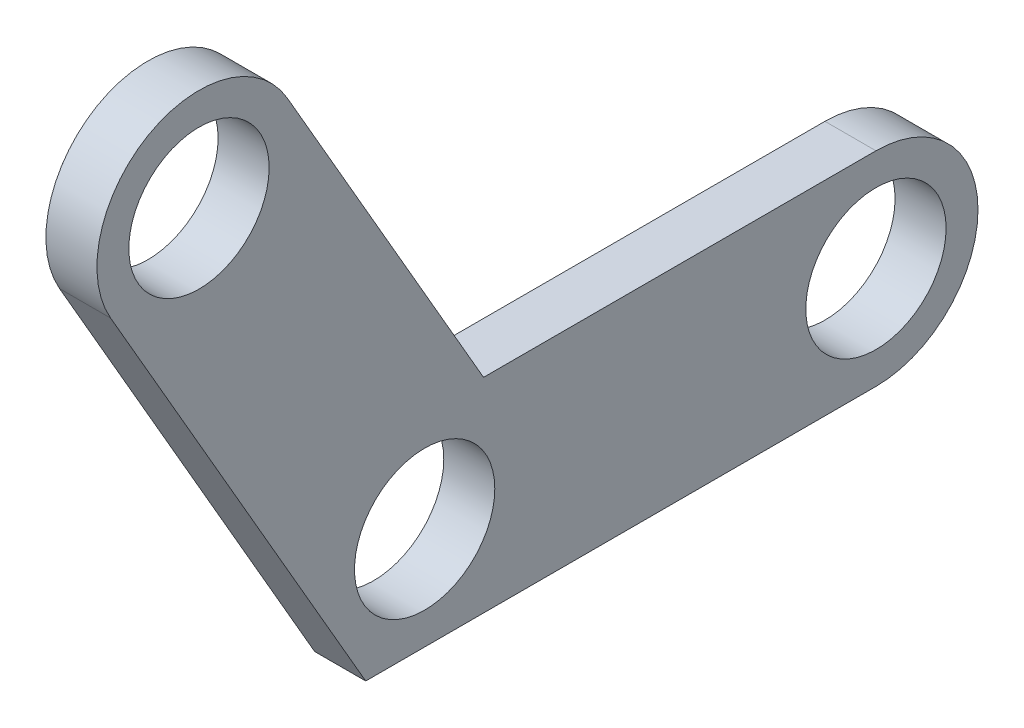
ISO-10303-21;
HEADER;
FILE_DESCRIPTION(('STEP AP214'),'2;1');
FILE_NAME('part.step','',(''),(''),'','','');
FILE_SCHEMA(('AUTOMOTIVE_DESIGN { 1 0 10303 214 1 1 1 1 }'));
ENDSEC;
DATA;
#1=APPLICATION_CONTEXT('core data for automotive mechanical design processes');
#2=APPLICATION_PROTOCOL_DEFINITION('international standard','automotive_design',2000,#1);
#3=PRODUCT_CONTEXT('',#1,'mechanical');
#4=PRODUCT('Part','Part','',(#3));
#5=PRODUCT_RELATED_PRODUCT_CATEGORY('part','',(#4));
#6=PRODUCT_DEFINITION_FORMATION('','',#4);
#7=PRODUCT_DEFINITION_CONTEXT('part definition',#1,'design');
#8=PRODUCT_DEFINITION('design','',#6,#7);
#9=PRODUCT_DEFINITION_SHAPE('','',#8);
#10=(LENGTH_UNIT() NAMED_UNIT(*) SI_UNIT(.MILLI.,.METRE.));
#11=(NAMED_UNIT(*) PLANE_ANGLE_UNIT() SI_UNIT($,.RADIAN.));
#12=(NAMED_UNIT(*) SI_UNIT($,.STERADIAN.) SOLID_ANGLE_UNIT());
#13=UNCERTAINTY_MEASURE_WITH_UNIT(LENGTH_MEASURE(1.E-05),#10,'distance_accuracy_value','');
#14=(GEOMETRIC_REPRESENTATION_CONTEXT(3) GLOBAL_UNCERTAINTY_ASSIGNED_CONTEXT((#13)) GLOBAL_UNIT_ASSIGNED_CONTEXT((#10,
#11,#12)) REPRESENTATION_CONTEXT('',''));
#15=CARTESIAN_POINT('',(0.,0.,0.));
#16=DIRECTION('',(0.,0.,1.));
#17=DIRECTION('',(1.,0.,0.));
#18=AXIS2_PLACEMENT_3D('',#15,#16,#17);
#19=CARTESIAN_POINT('',(2.,4.,-20.));
#20=DIRECTION('',(1.,0.,0.));
#21=DIRECTION('',(0.,0.,-1.));
#22=AXIS2_PLACEMENT_3D('',#19,#20,#21);
#23=PLANE('',#22);
#24=CARTESIAN_POINT('',(2.,4.,-20.));
#25=DIRECTION('',(1.,0.,0.));
#26=DIRECTION('',(0.,0.,-1.));
#27=AXIS2_PLACEMENT_3D('',#24,#25,#26);
#28=CIRCLE('',#27,2.74999999999998);
#29=CARTESIAN_POINT('',(2.,4.,-22.75));
#30=VERTEX_POINT('',#29);
#31=EDGE_CURVE('E213',#30,#30,#28,.T.);
#32=ORIENTED_EDGE('',*,*,#31,.F.);
#33=EDGE_LOOP('',(#32));
#34=FACE_BOUND('',#33,.T.);
#35=DIRECTION('',(0.,0.,-1.));
#36=VECTOR('',#35,1.);
#37=CARTESIAN_POINT('',(2.,0.,0.));
#38=LINE('',#37,#36);
#39=CARTESIAN_POINT('',(2.,0.,0.));
#40=VERTEX_POINT('',#39);
#41=CARTESIAN_POINT('',(2.,0.,-20.));
#42=VERTEX_POINT('',#41);
#43=EDGE_CURVE('E152',#40,#42,#38,.T.);
#44=ORIENTED_EDGE('',*,*,#43,.T.);
#45=CARTESIAN_POINT('',(2.,4.,-20.));
#46=DIRECTION('',(1.,0.,0.));
#47=DIRECTION('',(0.,0.,-1.));
#48=AXIS2_PLACEMENT_3D('',#45,#46,#47);
#49=CIRCLE('',#48,4.);
#50=CARTESIAN_POINT('',(2.,8.,-20.));
#51=VERTEX_POINT('',#50);
#52=EDGE_CURVE('E100',#42,#51,#49,.T.);
#53=ORIENTED_EDGE('',*,*,#52,.T.);
#54=DIRECTION('',(0.,0.,1.));
#55=VECTOR('',#54,1.);
#56=CARTESIAN_POINT('',(2.,8.,-4.61880215351696));
#57=LINE('',#56,#55);
#58=CARTESIAN_POINT('',(2.,8.,-4.61880215351696));
#59=VERTEX_POINT('',#58);
#60=EDGE_CURVE('E113',#51,#59,#57,.T.);
#61=ORIENTED_EDGE('',*,*,#60,.T.);
#62=DIRECTION('',(0.,0.86602540378444,0.499999999999998));
#63=VECTOR('',#62,1.);
#64=CARTESIAN_POINT('',(2.,21.3205080756887,3.07179676972448));
#65=LINE('',#64,#63);
#66=CARTESIAN_POINT('',(2.,21.3205080756888,3.07179676972446));
#67=VERTEX_POINT('',#66);
#68=EDGE_CURVE('E107',#59,#67,#65,.T.);
#69=ORIENTED_EDGE('',*,*,#68,.T.);
#70=CARTESIAN_POINT('',(2.,19.3205080756888,6.5358983848622));
#71=DIRECTION('',(1.,0.,0.));
#72=DIRECTION('',(0.,0.,-1.));
#73=AXIS2_PLACEMENT_3D('',#70,#71,#72);
#74=CIRCLE('',#73,3.99999999999998);
#75=CARTESIAN_POINT('',(2.,17.3205080756888,9.99999999999996));
#76=VERTEX_POINT('',#75);
#77=EDGE_CURVE('E111',#67,#76,#74,.T.);
#78=ORIENTED_EDGE('',*,*,#77,.T.);
#79=DIRECTION('',(0.,-0.86602540378444,-0.499999999999998));
#80=VECTOR('',#79,1.);
#81=CARTESIAN_POINT('',(2.,0.,0.));
#82=LINE('',#81,#80);
#83=EDGE_CURVE('E63',#76,#40,#82,.T.);
#84=ORIENTED_EDGE('',*,*,#83,.T.);
#85=EDGE_LOOP('',(#44,#53,#61,#69,#78,#84));
#86=FACE_BOUND('',#85,.T.);
#87=CARTESIAN_POINT('',(2.,19.3205080756888,6.5358983848622));
#88=DIRECTION('',(1.,0.,0.));
#89=DIRECTION('',(0.,0.,-1.));
#90=AXIS2_PLACEMENT_3D('',#87,#88,#89);
#91=CIRCLE('',#90,2.75);
#92=CARTESIAN_POINT('',(2.,19.3205080756888,3.7858983848622));
#93=VERTEX_POINT('',#92);
#94=EDGE_CURVE('E140',#93,#93,#91,.T.);
#95=ORIENTED_EDGE('',*,*,#94,.F.);
#96=EDGE_LOOP('',(#95));
#97=FACE_BOUND('',#96,.T.);
#98=CARTESIAN_POINT('',(2.,4.,-2.30940107675851));
#99=DIRECTION('',(1.,0.,0.));
#100=DIRECTION('',(0.,0.,-1.));
#101=AXIS2_PLACEMENT_3D('',#98,#99,#100);
#102=CIRCLE('',#101,2.75);
#103=CARTESIAN_POINT('',(2.,4.,-5.05940107675851));
#104=VERTEX_POINT('',#103);
#105=EDGE_CURVE('E202',#104,#104,#102,.T.);
#106=ORIENTED_EDGE('',*,*,#105,.F.);
#107=EDGE_LOOP('',(#106));
#108=FACE_BOUND('',#107,.T.);
#109=ADVANCED_FACE('F45',(#34,#86,#97,#108),#23,.T.);
#110=CARTESIAN_POINT('',(0.,4.,-20.));
#111=DIRECTION('',(1.,0.,0.));
#112=DIRECTION('',(0.,0.,-1.));
#113=AXIS2_PLACEMENT_3D('',#110,#111,#112);
#114=PLANE('',#113);
#115=DIRECTION('',(0.,0.,-1.));
#116=VECTOR('',#115,1.);
#117=CARTESIAN_POINT('',(0.,0.,0.));
#118=LINE('',#117,#116);
#119=CARTESIAN_POINT('',(0.,0.,0.));
#120=VERTEX_POINT('',#119);
#121=CARTESIAN_POINT('',(0.,0.,-20.));
#122=VERTEX_POINT('',#121);
#123=EDGE_CURVE('E135',#120,#122,#118,.T.);
#124=ORIENTED_EDGE('',*,*,#123,.F.);
#125=DIRECTION('',(0.,-0.86602540378444,-0.499999999999998));
#126=VECTOR('',#125,1.);
#127=CARTESIAN_POINT('',(0.,0.,0.));
#128=LINE('',#127,#126);
#129=CARTESIAN_POINT('',(0.,17.3205080756888,9.99999999999996));
#130=VERTEX_POINT('',#129);
#131=EDGE_CURVE('E92',#130,#120,#128,.T.);
#132=ORIENTED_EDGE('',*,*,#131,.F.);
#133=CARTESIAN_POINT('',(0.,19.3205080756888,6.5358983848622));
#134=DIRECTION('',(1.,0.,0.));
#135=DIRECTION('',(0.,0.,-1.));
#136=AXIS2_PLACEMENT_3D('',#133,#134,#135);
#137=CIRCLE('',#136,3.99999999999998);
#138=CARTESIAN_POINT('',(0.,21.3205080756888,3.07179676972446));
#139=VERTEX_POINT('',#138);
#140=EDGE_CURVE('E86',#139,#130,#137,.T.);
#141=ORIENTED_EDGE('',*,*,#140,.F.);
#142=DIRECTION('',(0.,0.86602540378444,0.499999999999998));
#143=VECTOR('',#142,1.);
#144=CARTESIAN_POINT('',(0.,21.3205080756887,3.07179676972448));
#145=LINE('',#144,#143);
#146=CARTESIAN_POINT('',(0.,8.,-4.61880215351696));
#147=VERTEX_POINT('',#146);
#148=EDGE_CURVE('E122',#147,#139,#145,.T.);
#149=ORIENTED_EDGE('',*,*,#148,.F.);
#150=DIRECTION('',(0.,0.,1.));
#151=VECTOR('',#150,1.);
#152=CARTESIAN_POINT('',(0.,8.,-4.61880215351696));
#153=LINE('',#152,#151);
#154=CARTESIAN_POINT('',(0.,8.,-20.));
#155=VERTEX_POINT('',#154);
#156=EDGE_CURVE('E143',#155,#147,#153,.T.);
#157=ORIENTED_EDGE('',*,*,#156,.F.);
#158=CARTESIAN_POINT('',(0.,4.,-20.));
#159=DIRECTION('',(1.,0.,0.));
#160=DIRECTION('',(0.,0.,-1.));
#161=AXIS2_PLACEMENT_3D('',#158,#159,#160);
#162=CIRCLE('',#161,4.);
#163=EDGE_CURVE('E139',#122,#155,#162,.T.);
#164=ORIENTED_EDGE('',*,*,#163,.F.);
#165=EDGE_LOOP('',(#124,#132,#141,#149,#157,#164));
#166=FACE_BOUND('',#165,.T.);
#167=CARTESIAN_POINT('',(0.,19.3205080756888,6.5358983848622));
#168=DIRECTION('',(1.,0.,0.));
#169=DIRECTION('',(0.,0.,-1.));
#170=AXIS2_PLACEMENT_3D('',#167,#168,#169);
#171=CIRCLE('',#170,2.75);
#172=CARTESIAN_POINT('',(0.,19.3205080756888,3.7858983848622));
#173=VERTEX_POINT('',#172);
#174=EDGE_CURVE('E217',#173,#173,#171,.T.);
#175=ORIENTED_EDGE('',*,*,#174,.T.);
#176=EDGE_LOOP('',(#175));
#177=FACE_BOUND('',#176,.T.);
#178=CARTESIAN_POINT('',(0.,4.,-20.));
#179=DIRECTION('',(1.,0.,0.));
#180=DIRECTION('',(0.,0.,-1.));
#181=AXIS2_PLACEMENT_3D('',#178,#179,#180);
#182=CIRCLE('',#181,2.74999999999998);
#183=CARTESIAN_POINT('',(0.,4.,-22.75));
#184=VERTEX_POINT('',#183);
#185=EDGE_CURVE('E210',#184,#184,#182,.T.);
#186=ORIENTED_EDGE('',*,*,#185,.T.);
#187=EDGE_LOOP('',(#186));
#188=FACE_BOUND('',#187,.T.);
#189=CARTESIAN_POINT('',(0.,4.,-2.30940107675851));
#190=DIRECTION('',(1.,0.,0.));
#191=DIRECTION('',(0.,0.,-1.));
#192=AXIS2_PLACEMENT_3D('',#189,#190,#191);
#193=CIRCLE('',#192,2.75);
#194=CARTESIAN_POINT('',(0.,4.,-5.05940107675851));
#195=VERTEX_POINT('',#194);
#196=EDGE_CURVE('E205',#195,#195,#193,.T.);
#197=ORIENTED_EDGE('',*,*,#196,.T.);
#198=EDGE_LOOP('',(#197));
#199=FACE_BOUND('',#198,.T.);
#200=ADVANCED_FACE('F165',(#166,#177,#188,#199),#114,.F.);
#201=CARTESIAN_POINT('',(2.,0.,0.));
#202=DIRECTION('',(0.,1.,0.));
#203=DIRECTION('',(0.,0.,1.));
#204=AXIS2_PLACEMENT_3D('',#201,#202,#203);
#205=PLANE('',#204);
#206=ORIENTED_EDGE('',*,*,#123,.T.);
#207=DIRECTION('',(-1.,0.,0.));
#208=VECTOR('',#207,1.);
#209=CARTESIAN_POINT('',(2.,0.,-20.));
#210=LINE('',#209,#208);
#211=EDGE_CURVE('E11',#42,#122,#210,.T.);
#212=ORIENTED_EDGE('',*,*,#211,.F.);
#213=ORIENTED_EDGE('',*,*,#43,.F.);
#214=DIRECTION('',(-1.,0.,0.));
#215=VECTOR('',#214,1.);
#216=CARTESIAN_POINT('',(2.,0.,0.));
#217=LINE('',#216,#215);
#218=EDGE_CURVE('E131',#40,#120,#217,.T.);
#219=ORIENTED_EDGE('',*,*,#218,.T.);
#220=EDGE_LOOP('',(#206,#212,#213,#219));
#221=FACE_BOUND('',#220,.T.);
#222=ADVANCED_FACE('F47',(#221),#205,.F.);
#223=CARTESIAN_POINT('',(2.,4.,-20.));
#224=DIRECTION('',(-1.,0.,0.));
#225=DIRECTION('',(0.,0.,1.));
#226=AXIS2_PLACEMENT_3D('',#223,#224,#225);
#227=CYLINDRICAL_SURFACE('',#226,4.);
#228=ORIENTED_EDGE('',*,*,#163,.T.);
#229=DIRECTION('',(-1.,0.,0.));
#230=VECTOR('',#229,1.);
#231=CARTESIAN_POINT('',(2.,8.,-20.));
#232=LINE('',#231,#230);
#233=EDGE_CURVE('E55',#51,#155,#232,.T.);
#234=ORIENTED_EDGE('',*,*,#233,.F.);
#235=ORIENTED_EDGE('',*,*,#52,.F.);
#236=ORIENTED_EDGE('',*,*,#211,.T.);
#237=EDGE_LOOP('',(#228,#234,#235,#236));
#238=FACE_BOUND('',#237,.T.);
#239=ADVANCED_FACE('F276',(#238),#227,.T.);
#240=CARTESIAN_POINT('',(2.,8.,-4.61880215351696));
#241=DIRECTION('',(0.,-1.,0.));
#242=DIRECTION('',(0.,0.,-1.));
#243=AXIS2_PLACEMENT_3D('',#240,#241,#242);
#244=PLANE('',#243);
#245=ORIENTED_EDGE('',*,*,#156,.T.);
#246=DIRECTION('',(-1.,0.,0.));
#247=VECTOR('',#246,1.);
#248=CARTESIAN_POINT('',(2.,8.,-4.61880215351696));
#249=LINE('',#248,#247);
#250=EDGE_CURVE('E124',#59,#147,#249,.T.);
#251=ORIENTED_EDGE('',*,*,#250,.F.);
#252=ORIENTED_EDGE('',*,*,#60,.F.);
#253=ORIENTED_EDGE('',*,*,#233,.T.);
#254=EDGE_LOOP('',(#245,#251,#252,#253));
#255=FACE_BOUND('',#254,.T.);
#256=ADVANCED_FACE('F162',(#255),#244,.F.);
#257=CARTESIAN_POINT('',(2.,21.3205080756887,3.07179676972448));
#258=DIRECTION('',(0.,-0.499999999999998,0.86602540378444));
#259=DIRECTION('',(0.,-0.86602540378444,-0.499999999999998));
#260=AXIS2_PLACEMENT_3D('',#257,#258,#259);
#261=PLANE('',#260);
#262=ORIENTED_EDGE('',*,*,#148,.T.);
#263=DIRECTION('',(-1.,0.,0.));
#264=VECTOR('',#263,1.);
#265=CARTESIAN_POINT('',(2.,21.3205080756888,3.07179676972446));
#266=LINE('',#265,#264);
#267=EDGE_CURVE('E119',#67,#139,#266,.T.);
#268=ORIENTED_EDGE('',*,*,#267,.F.);
#269=ORIENTED_EDGE('',*,*,#68,.F.);
#270=ORIENTED_EDGE('',*,*,#250,.T.);
#271=EDGE_LOOP('',(#262,#268,#269,#270));
#272=FACE_BOUND('',#271,.T.);
#273=ADVANCED_FACE('F120',(#272),#261,.F.);
#274=CARTESIAN_POINT('',(2.,19.3205080756888,6.5358983848622));
#275=DIRECTION('',(-1.,0.,0.));
#276=DIRECTION('',(0.,0.,1.));
#277=AXIS2_PLACEMENT_3D('',#274,#275,#276);
#278=CYLINDRICAL_SURFACE('',#277,3.99999999999998);
#279=ORIENTED_EDGE('',*,*,#140,.T.);
#280=DIRECTION('',(-1.,0.,0.));
#281=VECTOR('',#280,1.);
#282=CARTESIAN_POINT('',(2.,17.3205080756888,9.99999999999996));
#283=LINE('',#282,#281);
#284=EDGE_CURVE('E125',#76,#130,#283,.T.);
#285=ORIENTED_EDGE('',*,*,#284,.F.);
#286=ORIENTED_EDGE('',*,*,#77,.F.);
#287=ORIENTED_EDGE('',*,*,#267,.T.);
#288=EDGE_LOOP('',(#279,#285,#286,#287));
#289=FACE_BOUND('',#288,.T.);
#290=ADVANCED_FACE('F127',(#289),#278,.T.);
#291=CARTESIAN_POINT('',(2.,0.,0.));
#292=DIRECTION('',(0.,0.499999999999998,-0.86602540378444));
#293=DIRECTION('',(0.,0.86602540378444,0.499999999999998));
#294=AXIS2_PLACEMENT_3D('',#291,#292,#293);
#295=PLANE('',#294);
#296=ORIENTED_EDGE('',*,*,#131,.T.);
#297=ORIENTED_EDGE('',*,*,#218,.F.);
#298=ORIENTED_EDGE('',*,*,#83,.F.);
#299=ORIENTED_EDGE('',*,*,#284,.T.);
#300=EDGE_LOOP('',(#296,#297,#298,#299));
#301=FACE_BOUND('',#300,.T.);
#302=ADVANCED_FACE('F170',(#301),#295,.F.);
#303=CARTESIAN_POINT('',(2.,19.3205080756888,6.5358983848622));
#304=DIRECTION('',(-1.,0.,0.));
#305=DIRECTION('',(0.,0.,1.));
#306=AXIS2_PLACEMENT_3D('',#303,#304,#305);
#307=CYLINDRICAL_SURFACE('',#306,2.75);
#308=ORIENTED_EDGE('',*,*,#94,.T.);
#309=EDGE_LOOP('',(#308));
#310=FACE_BOUND('',#309,.T.);
#311=ORIENTED_EDGE('',*,*,#174,.F.);
#312=EDGE_LOOP('',(#311));
#313=FACE_BOUND('',#312,.T.);
#314=ADVANCED_FACE('F172',(#310,#313),#307,.F.);
#315=CARTESIAN_POINT('',(2.,4.,-20.));
#316=DIRECTION('',(-1.,0.,0.));
#317=DIRECTION('',(0.,0.,1.));
#318=AXIS2_PLACEMENT_3D('',#315,#316,#317);
#319=CYLINDRICAL_SURFACE('',#318,2.74999999999998);
#320=ORIENTED_EDGE('',*,*,#31,.T.);
#321=EDGE_LOOP('',(#320));
#322=FACE_BOUND('',#321,.T.);
#323=ORIENTED_EDGE('',*,*,#185,.F.);
#324=EDGE_LOOP('',(#323));
#325=FACE_BOUND('',#324,.T.);
#326=ADVANCED_FACE('F178',(#322,#325),#319,.F.);
#327=CARTESIAN_POINT('',(2.,4.,-2.30940107675851));
#328=DIRECTION('',(-1.,0.,0.));
#329=DIRECTION('',(0.,0.,1.));
#330=AXIS2_PLACEMENT_3D('',#327,#328,#329);
#331=CYLINDRICAL_SURFACE('',#330,2.75);
#332=ORIENTED_EDGE('',*,*,#105,.T.);
#333=EDGE_LOOP('',(#332));
#334=FACE_BOUND('',#333,.T.);
#335=ORIENTED_EDGE('',*,*,#196,.F.);
#336=EDGE_LOOP('',(#335));
#337=FACE_BOUND('',#336,.T.);
#338=ADVANCED_FACE('F193',(#334,#337),#331,.F.);
#339=CLOSED_SHELL('',(#109,#200,#222,#239,#256,#273,#290,#302,#314,#326,#338));
#340=MANIFOLD_SOLID_BREP('B2',#339);
#341=ADVANCED_BREP_SHAPE_REPRESENTATION('',(#18,#340),#14);
#342=SHAPE_DEFINITION_REPRESENTATION(#9,#341);
ENDSEC;
END-ISO-10303-21;
